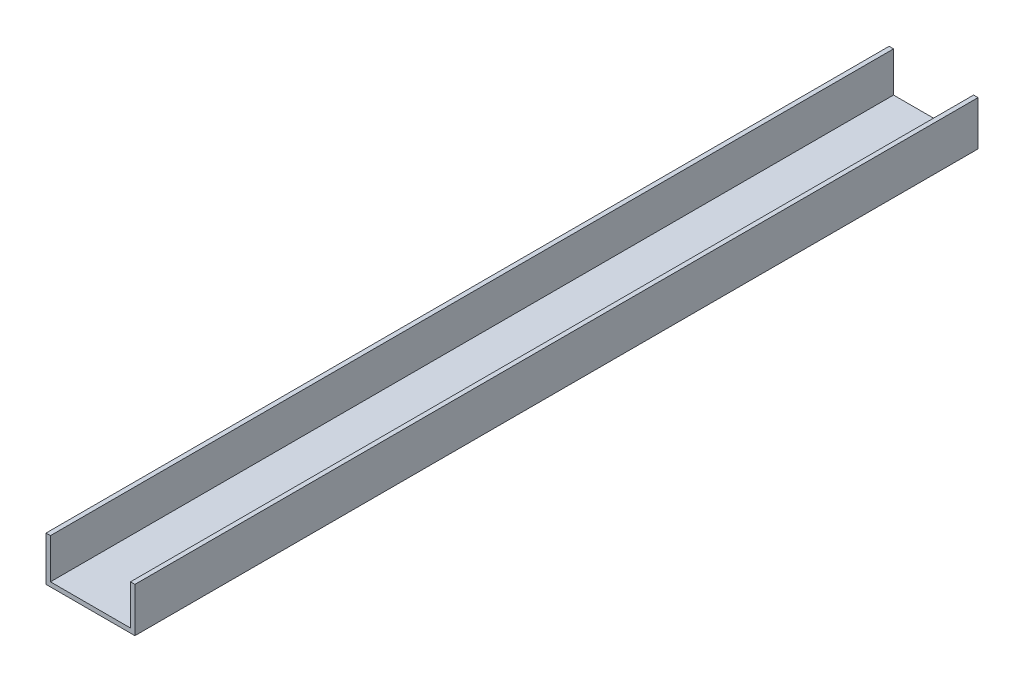
ISO-10303-21;
HEADER;
FILE_DESCRIPTION(('STEP AP214'),'2;1');
FILE_NAME('part.step','',(''),(''),'','','');
FILE_SCHEMA(('AUTOMOTIVE_DESIGN { 1 0 10303 214 1 1 1 1 }'));
ENDSEC;
DATA;
#1=APPLICATION_CONTEXT('core data for automotive mechanical design processes');
#2=APPLICATION_PROTOCOL_DEFINITION('international standard','automotive_design',2000,#1);
#3=PRODUCT_CONTEXT('',#1,'mechanical');
#4=PRODUCT('Part','Part','',(#3));
#5=PRODUCT_RELATED_PRODUCT_CATEGORY('part','',(#4));
#6=PRODUCT_DEFINITION_FORMATION('','',#4);
#7=PRODUCT_DEFINITION_CONTEXT('part definition',#1,'design');
#8=PRODUCT_DEFINITION('design','',#6,#7);
#9=PRODUCT_DEFINITION_SHAPE('','',#8);
#10=(LENGTH_UNIT() NAMED_UNIT(*) SI_UNIT(.MILLI.,.METRE.));
#11=(NAMED_UNIT(*) PLANE_ANGLE_UNIT() SI_UNIT($,.RADIAN.));
#12=(NAMED_UNIT(*) SI_UNIT($,.STERADIAN.) SOLID_ANGLE_UNIT());
#13=UNCERTAINTY_MEASURE_WITH_UNIT(LENGTH_MEASURE(1.E-05),#10,'distance_accuracy_value','');
#14=(GEOMETRIC_REPRESENTATION_CONTEXT(3) GLOBAL_UNCERTAINTY_ASSIGNED_CONTEXT((#13)) GLOBAL_UNIT_ASSIGNED_CONTEXT((#10,
#11,#12)) REPRESENTATION_CONTEXT('',''));
#15=CARTESIAN_POINT('',(0.,0.,0.));
#16=DIRECTION('',(0.,0.,1.));
#17=DIRECTION('',(1.,0.,0.));
#18=AXIS2_PLACEMENT_3D('',#15,#16,#17);
#19=CARTESIAN_POINT('',(-22.9867221873036,26.6860465116279,569.));
#20=DIRECTION('',(1.,0.,0.));
#21=DIRECTION('',(0.,0.,-1.));
#22=AXIS2_PLACEMENT_3D('',#19,#20,#21);
#23=PLANE('',#22);
#24=DIRECTION('',(0.,-1.,0.));
#25=VECTOR('',#24,1.);
#26=CARTESIAN_POINT('',(-22.9867221873036,26.6860465116279,0.));
#27=LINE('',#26,#25);
#28=CARTESIAN_POINT('',(-22.9867221873036,26.6860465116279,0.));
#29=VERTEX_POINT('',#28);
#30=CARTESIAN_POINT('',(-22.9867221873036,-3.31395348837209,0.));
#31=VERTEX_POINT('',#30);
#32=EDGE_CURVE('E140',#29,#31,#27,.T.);
#33=ORIENTED_EDGE('',*,*,#32,.T.);
#34=DIRECTION('',(0.,0.,-1.));
#35=VECTOR('',#34,1.);
#36=CARTESIAN_POINT('',(-22.9867221873036,-3.31395348837209,569.));
#37=LINE('',#36,#35);
#38=CARTESIAN_POINT('',(-22.9867221873036,-3.31395348837209,569.));
#39=VERTEX_POINT('',#38);
#40=EDGE_CURVE('E11',#39,#31,#37,.T.);
#41=ORIENTED_EDGE('',*,*,#40,.F.);
#42=DIRECTION('',(0.,-1.,0.));
#43=VECTOR('',#42,1.);
#44=CARTESIAN_POINT('',(-22.9867221873036,26.6860465116279,569.));
#45=LINE('',#44,#43);
#46=CARTESIAN_POINT('',(-22.9867221873036,26.6860465116279,569.));
#47=VERTEX_POINT('',#46);
#48=EDGE_CURVE('E162',#47,#39,#45,.T.);
#49=ORIENTED_EDGE('',*,*,#48,.F.);
#50=DIRECTION('',(0.,0.,-1.));
#51=VECTOR('',#50,1.);
#52=CARTESIAN_POINT('',(-22.9867221873036,26.6860465116279,569.));
#53=LINE('',#52,#51);
#54=EDGE_CURVE('E136',#47,#29,#53,.T.);
#55=ORIENTED_EDGE('',*,*,#54,.T.);
#56=EDGE_LOOP('',(#33,#41,#49,#55));
#57=FACE_BOUND('',#56,.T.);
#58=ADVANCED_FACE('F39',(#57),#23,.F.);
#59=CARTESIAN_POINT('',(-22.9867221873036,-3.31395348837209,569.));
#60=DIRECTION('',(0.,1.,0.));
#61=DIRECTION('',(0.,0.,1.));
#62=AXIS2_PLACEMENT_3D('',#59,#60,#61);
#63=PLANE('',#62);
#64=DIRECTION('',(1.,0.,0.));
#65=VECTOR('',#64,1.);
#66=CARTESIAN_POINT('',(-22.9867221873036,-3.31395348837209,0.));
#67=LINE('',#66,#65);
#68=CARTESIAN_POINT('',(37.0132778126964,-3.31395348837209,0.));
#69=VERTEX_POINT('',#68);
#70=EDGE_CURVE('E144',#31,#69,#67,.T.);
#71=ORIENTED_EDGE('',*,*,#70,.T.);
#72=DIRECTION('',(0.,0.,-1.));
#73=VECTOR('',#72,1.);
#74=CARTESIAN_POINT('',(37.0132778126964,-3.31395348837209,569.));
#75=LINE('',#74,#73);
#76=CARTESIAN_POINT('',(37.0132778126964,-3.31395348837209,569.));
#77=VERTEX_POINT('',#76);
#78=EDGE_CURVE('E48',#77,#69,#75,.T.);
#79=ORIENTED_EDGE('',*,*,#78,.F.);
#80=DIRECTION('',(1.,0.,0.));
#81=VECTOR('',#80,1.);
#82=CARTESIAN_POINT('',(-22.9867221873036,-3.31395348837209,569.));
#83=LINE('',#82,#81);
#84=EDGE_CURVE('E99',#39,#77,#83,.T.);
#85=ORIENTED_EDGE('',*,*,#84,.F.);
#86=ORIENTED_EDGE('',*,*,#40,.T.);
#87=EDGE_LOOP('',(#71,#79,#85,#86));
#88=FACE_BOUND('',#87,.T.);
#89=ADVANCED_FACE('F208',(#88),#63,.F.);
#90=CARTESIAN_POINT('',(37.0132778126964,-3.31395348837209,569.));
#91=DIRECTION('',(-1.,0.,0.));
#92=DIRECTION('',(0.,0.,1.));
#93=AXIS2_PLACEMENT_3D('',#90,#91,#92);
#94=PLANE('',#93);
#95=DIRECTION('',(0.,1.,0.));
#96=VECTOR('',#95,1.);
#97=CARTESIAN_POINT('',(37.0132778126964,-3.31395348837209,0.));
#98=LINE('',#97,#96);
#99=CARTESIAN_POINT('',(37.0132778126964,26.6860465116279,0.));
#100=VERTEX_POINT('',#99);
#101=EDGE_CURVE('E147',#69,#100,#98,.T.);
#102=ORIENTED_EDGE('',*,*,#101,.T.);
#103=DIRECTION('',(0.,0.,-1.));
#104=VECTOR('',#103,1.);
#105=CARTESIAN_POINT('',(37.0132778126964,26.6860465116279,569.));
#106=LINE('',#105,#104);
#107=CARTESIAN_POINT('',(37.0132778126964,26.6860465116279,569.));
#108=VERTEX_POINT('',#107);
#109=EDGE_CURVE('E173',#108,#100,#106,.T.);
#110=ORIENTED_EDGE('',*,*,#109,.F.);
#111=DIRECTION('',(0.,1.,0.));
#112=VECTOR('',#111,1.);
#113=CARTESIAN_POINT('',(37.0132778126964,-3.31395348837209,569.));
#114=LINE('',#113,#112);
#115=EDGE_CURVE('E183',#77,#108,#114,.T.);
#116=ORIENTED_EDGE('',*,*,#115,.F.);
#117=ORIENTED_EDGE('',*,*,#78,.T.);
#118=EDGE_LOOP('',(#102,#110,#116,#117));
#119=FACE_BOUND('',#118,.T.);
#120=ADVANCED_FACE('F181',(#119),#94,.F.);
#121=CARTESIAN_POINT('',(37.0132778126964,26.6860465116279,569.));
#122=DIRECTION('',(0.,-1.,0.));
#123=DIRECTION('',(0.,0.,-1.));
#124=AXIS2_PLACEMENT_3D('',#121,#122,#123);
#125=PLANE('',#124);
#126=DIRECTION('',(-1.,0.,0.));
#127=VECTOR('',#126,1.);
#128=CARTESIAN_POINT('',(37.0132778126964,26.6860465116279,0.));
#129=LINE('',#128,#127);
#130=CARTESIAN_POINT('',(34.0132778126964,26.6860465116279,0.));
#131=VERTEX_POINT('',#130);
#132=EDGE_CURVE('E150',#100,#131,#129,.T.);
#133=ORIENTED_EDGE('',*,*,#132,.T.);
#134=DIRECTION('',(0.,0.,-1.));
#135=VECTOR('',#134,1.);
#136=CARTESIAN_POINT('',(34.0132778126964,26.6860465116279,569.));
#137=LINE('',#136,#135);
#138=CARTESIAN_POINT('',(34.0132778126964,26.6860465116279,569.));
#139=VERTEX_POINT('',#138);
#140=EDGE_CURVE('E169',#139,#131,#137,.T.);
#141=ORIENTED_EDGE('',*,*,#140,.F.);
#142=DIRECTION('',(-1.,0.,0.));
#143=VECTOR('',#142,1.);
#144=CARTESIAN_POINT('',(37.0132778126964,26.6860465116279,569.));
#145=LINE('',#144,#143);
#146=EDGE_CURVE('E196',#108,#139,#145,.T.);
#147=ORIENTED_EDGE('',*,*,#146,.F.);
#148=ORIENTED_EDGE('',*,*,#109,.T.);
#149=EDGE_LOOP('',(#133,#141,#147,#148));
#150=FACE_BOUND('',#149,.T.);
#151=ADVANCED_FACE('F191',(#150),#125,.F.);
#152=CARTESIAN_POINT('',(34.0132778126964,26.6860465116279,569.));
#153=DIRECTION('',(1.,0.,0.));
#154=DIRECTION('',(0.,1.,0.));
#155=AXIS2_PLACEMENT_3D('',#152,#153,#154);
#156=PLANE('',#155);
#157=DIRECTION('',(0.,-1.,0.));
#158=VECTOR('',#157,1.);
#159=CARTESIAN_POINT('',(34.0132778126964,26.6860465116279,0.));
#160=LINE('',#159,#158);
#161=CARTESIAN_POINT('',(34.0132778126964,-0.313953488372095,0.));
#162=VERTEX_POINT('',#161);
#163=EDGE_CURVE('E153',#131,#162,#160,.T.);
#164=ORIENTED_EDGE('',*,*,#163,.T.);
#165=DIRECTION('',(0.,0.,-1.));
#166=VECTOR('',#165,1.);
#167=CARTESIAN_POINT('',(34.0132778126964,-0.313953488372095,569.));
#168=LINE('',#167,#166);
#169=CARTESIAN_POINT('',(34.0132778126964,-0.313953488372095,569.));
#170=VERTEX_POINT('',#169);
#171=EDGE_CURVE('E129',#170,#162,#168,.T.);
#172=ORIENTED_EDGE('',*,*,#171,.F.);
#173=DIRECTION('',(0.,-1.,0.));
#174=VECTOR('',#173,1.);
#175=CARTESIAN_POINT('',(34.0132778126964,26.6860465116279,569.));
#176=LINE('',#175,#174);
#177=EDGE_CURVE('E118',#139,#170,#176,.T.);
#178=ORIENTED_EDGE('',*,*,#177,.F.);
#179=ORIENTED_EDGE('',*,*,#140,.T.);
#180=EDGE_LOOP('',(#164,#172,#178,#179));
#181=FACE_BOUND('',#180,.T.);
#182=ADVANCED_FACE('F194',(#181),#156,.F.);
#183=CARTESIAN_POINT('',(34.0132778126964,-0.313953488372095,569.));
#184=DIRECTION('',(0.,-1.,0.));
#185=DIRECTION('',(1.,0.,0.));
#186=AXIS2_PLACEMENT_3D('',#183,#184,#185);
#187=PLANE('',#186);
#188=DIRECTION('',(-1.,0.,0.));
#189=VECTOR('',#188,1.);
#190=CARTESIAN_POINT('',(34.0132778126964,-0.313953488372095,0.));
#191=LINE('',#190,#189);
#192=CARTESIAN_POINT('',(-19.9867221873036,-0.313953488372102,0.));
#193=VERTEX_POINT('',#192);
#194=EDGE_CURVE('E127',#162,#193,#191,.T.);
#195=ORIENTED_EDGE('',*,*,#194,.T.);
#196=DIRECTION('',(0.,0.,-1.));
#197=VECTOR('',#196,1.);
#198=CARTESIAN_POINT('',(-19.9867221873036,-0.313953488372102,569.));
#199=LINE('',#198,#197);
#200=CARTESIAN_POINT('',(-19.9867221873036,-0.313953488372102,569.));
#201=VERTEX_POINT('',#200);
#202=EDGE_CURVE('E124',#201,#193,#199,.T.);
#203=ORIENTED_EDGE('',*,*,#202,.F.);
#204=DIRECTION('',(-1.,0.,0.));
#205=VECTOR('',#204,1.);
#206=CARTESIAN_POINT('',(34.0132778126964,-0.313953488372095,569.));
#207=LINE('',#206,#205);
#208=EDGE_CURVE('E112',#170,#201,#207,.T.);
#209=ORIENTED_EDGE('',*,*,#208,.F.);
#210=ORIENTED_EDGE('',*,*,#171,.T.);
#211=EDGE_LOOP('',(#195,#203,#209,#210));
#212=FACE_BOUND('',#211,.T.);
#213=ADVANCED_FACE('F125',(#212),#187,.F.);
#214=CARTESIAN_POINT('',(-19.9867221873036,-0.313953488372102,569.));
#215=DIRECTION('',(-1.,0.,0.));
#216=DIRECTION('',(0.,0.,1.));
#217=AXIS2_PLACEMENT_3D('',#214,#215,#216);
#218=PLANE('',#217);
#219=DIRECTION('',(0.,1.,0.));
#220=VECTOR('',#219,1.);
#221=CARTESIAN_POINT('',(-19.9867221873036,-0.313953488372102,0.));
#222=LINE('',#221,#220);
#223=CARTESIAN_POINT('',(-19.9867221873036,26.6860465116279,0.));
#224=VERTEX_POINT('',#223);
#225=EDGE_CURVE('E85',#193,#224,#222,.T.);
#226=ORIENTED_EDGE('',*,*,#225,.T.);
#227=DIRECTION('',(0.,0.,-1.));
#228=VECTOR('',#227,1.);
#229=CARTESIAN_POINT('',(-19.9867221873036,26.6860465116279,569.));
#230=LINE('',#229,#228);
#231=CARTESIAN_POINT('',(-19.9867221873036,26.6860465116279,569.));
#232=VERTEX_POINT('',#231);
#233=EDGE_CURVE('E130',#232,#224,#230,.T.);
#234=ORIENTED_EDGE('',*,*,#233,.F.);
#235=DIRECTION('',(0.,1.,0.));
#236=VECTOR('',#235,1.);
#237=CARTESIAN_POINT('',(-19.9867221873036,-0.313953488372102,569.));
#238=LINE('',#237,#236);
#239=EDGE_CURVE('E116',#201,#232,#238,.T.);
#240=ORIENTED_EDGE('',*,*,#239,.F.);
#241=ORIENTED_EDGE('',*,*,#202,.T.);
#242=EDGE_LOOP('',(#226,#234,#240,#241));
#243=FACE_BOUND('',#242,.T.);
#244=ADVANCED_FACE('F132',(#243),#218,.F.);
#245=CARTESIAN_POINT('',(-19.9867221873036,26.6860465116279,569.));
#246=DIRECTION('',(0.,-1.,0.));
#247=DIRECTION('',(1.,0.,0.));
#248=AXIS2_PLACEMENT_3D('',#245,#246,#247);
#249=PLANE('',#248);
#250=DIRECTION('',(-1.,0.,0.));
#251=VECTOR('',#250,1.);
#252=CARTESIAN_POINT('',(-19.9867221873036,26.6860465116279,0.));
#253=LINE('',#252,#251);
#254=EDGE_CURVE('E91',#224,#29,#253,.T.);
#255=ORIENTED_EDGE('',*,*,#254,.T.);
#256=ORIENTED_EDGE('',*,*,#54,.F.);
#257=DIRECTION('',(-1.,0.,0.));
#258=VECTOR('',#257,1.);
#259=CARTESIAN_POINT('',(-19.9867221873036,26.6860465116279,569.));
#260=LINE('',#259,#258);
#261=EDGE_CURVE('E56',#232,#47,#260,.T.);
#262=ORIENTED_EDGE('',*,*,#261,.F.);
#263=ORIENTED_EDGE('',*,*,#233,.T.);
#264=EDGE_LOOP('',(#255,#256,#262,#263));
#265=FACE_BOUND('',#264,.T.);
#266=ADVANCED_FACE('F224',(#265),#249,.F.);
#267=CARTESIAN_POINT('',(0.,0.,569.));
#268=DIRECTION('',(0.,0.,1.));
#269=DIRECTION('',(1.,0.,0.));
#270=AXIS2_PLACEMENT_3D('',#267,#268,#269);
#271=PLANE('',#270);
#272=ORIENTED_EDGE('',*,*,#48,.T.);
#273=ORIENTED_EDGE('',*,*,#84,.T.);
#274=ORIENTED_EDGE('',*,*,#115,.T.);
#275=ORIENTED_EDGE('',*,*,#146,.T.);
#276=ORIENTED_EDGE('',*,*,#177,.T.);
#277=ORIENTED_EDGE('',*,*,#208,.T.);
#278=ORIENTED_EDGE('',*,*,#239,.T.);
#279=ORIENTED_EDGE('',*,*,#261,.T.);
#280=EDGE_LOOP('',(#272,#273,#274,#275,#276,#277,#278,#279));
#281=FACE_BOUND('',#280,.T.);
#282=ADVANCED_FACE('F114',(#281),#271,.T.);
#283=CARTESIAN_POINT('',(0.,0.,0.));
#284=DIRECTION('',(0.,0.,1.));
#285=DIRECTION('',(1.,0.,0.));
#286=AXIS2_PLACEMENT_3D('',#283,#284,#285);
#287=PLANE('',#286);
#288=ORIENTED_EDGE('',*,*,#32,.F.);
#289=ORIENTED_EDGE('',*,*,#254,.F.);
#290=ORIENTED_EDGE('',*,*,#225,.F.);
#291=ORIENTED_EDGE('',*,*,#194,.F.);
#292=ORIENTED_EDGE('',*,*,#163,.F.);
#293=ORIENTED_EDGE('',*,*,#132,.F.);
#294=ORIENTED_EDGE('',*,*,#101,.F.);
#295=ORIENTED_EDGE('',*,*,#70,.F.);
#296=EDGE_LOOP('',(#288,#289,#290,#291,#292,#293,#294,#295));
#297=FACE_BOUND('',#296,.T.);
#298=ADVANCED_FACE('F187',(#297),#287,.F.);
#299=CLOSED_SHELL('',(#58,#89,#120,#151,#182,#213,#244,#266,#282,#298));
#300=MANIFOLD_SOLID_BREP('B2',#299);
#301=ADVANCED_BREP_SHAPE_REPRESENTATION('',(#18,#300),#14);
#302=SHAPE_DEFINITION_REPRESENTATION(#9,#301);
ENDSEC;
END-ISO-10303-21;
